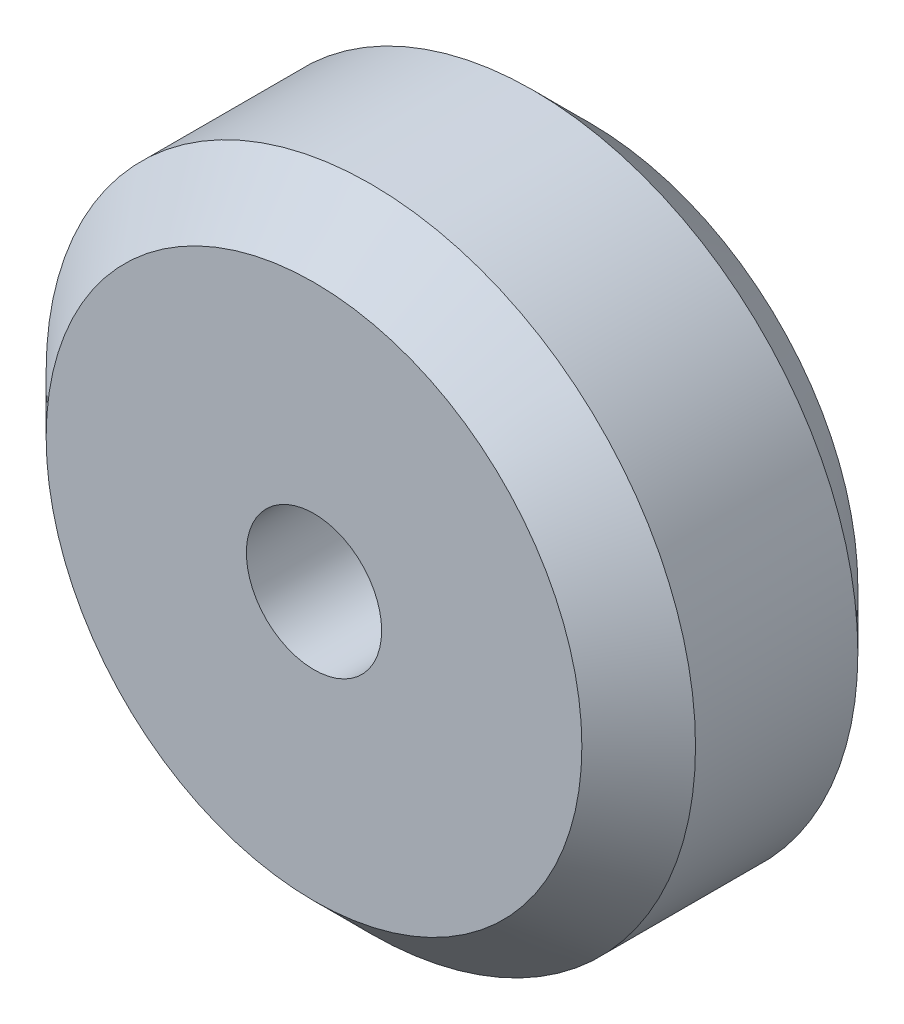
ISO-10303-21;
HEADER;
FILE_DESCRIPTION(('STEP AP214'),'2;1');
FILE_NAME('part.step','',(''),(''),'','','');
FILE_SCHEMA(('AUTOMOTIVE_DESIGN { 1 0 10303 214 1 1 1 1 }'));
ENDSEC;
DATA;
#1=APPLICATION_CONTEXT('core data for automotive mechanical design processes');
#2=APPLICATION_PROTOCOL_DEFINITION('international standard','automotive_design',2000,#1);
#3=PRODUCT_CONTEXT('',#1,'mechanical');
#4=PRODUCT('Part','Part','',(#3));
#5=PRODUCT_RELATED_PRODUCT_CATEGORY('part','',(#4));
#6=PRODUCT_DEFINITION_FORMATION('','',#4);
#7=PRODUCT_DEFINITION_CONTEXT('part definition',#1,'design');
#8=PRODUCT_DEFINITION('design','',#6,#7);
#9=PRODUCT_DEFINITION_SHAPE('','',#8);
#10=(LENGTH_UNIT() NAMED_UNIT(*) SI_UNIT(.MILLI.,.METRE.));
#11=(NAMED_UNIT(*) PLANE_ANGLE_UNIT() SI_UNIT($,.RADIAN.));
#12=(NAMED_UNIT(*) SI_UNIT($,.STERADIAN.) SOLID_ANGLE_UNIT());
#13=UNCERTAINTY_MEASURE_WITH_UNIT(LENGTH_MEASURE(1.E-05),#10,'distance_accuracy_value','');
#14=(GEOMETRIC_REPRESENTATION_CONTEXT(3) GLOBAL_UNCERTAINTY_ASSIGNED_CONTEXT((#13)) GLOBAL_UNIT_ASSIGNED_CONTEXT((#10,
#11,#12)) REPRESENTATION_CONTEXT('',''));
#15=CARTESIAN_POINT('',(0.,0.,0.));
#16=DIRECTION('',(0.,0.,1.));
#17=DIRECTION('',(1.,0.,0.));
#18=AXIS2_PLACEMENT_3D('',#15,#16,#17);
#19=CARTESIAN_POINT('',(0.,0.,10.2));
#20=DIRECTION('',(0.,0.,1.));
#21=DIRECTION('',(1.,0.,0.));
#22=AXIS2_PLACEMENT_3D('',#19,#20,#21);
#23=PLANE('',#22);
#24=CARTESIAN_POINT('',(0.,0.,10.2));
#25=DIRECTION('',(0.,0.,1.));
#26=DIRECTION('',(1.,0.,0.));
#27=AXIS2_PLACEMENT_3D('',#24,#25,#26);
#28=CIRCLE('',#27,9.9);
#29=CARTESIAN_POINT('',(-9.9,0.,10.2));
#30=VERTEX_POINT('',#29);
#31=EDGE_CURVE('E10',#30,#30,#28,.T.);
#32=ORIENTED_EDGE('',*,*,#31,.T.);
#33=EDGE_LOOP('',(#32));
#34=FACE_BOUND('',#33,.T.);
#35=CARTESIAN_POINT('',(0.,0.,10.2));
#36=DIRECTION('',(0.,0.,1.));
#37=DIRECTION('',(1.,0.,0.));
#38=AXIS2_PLACEMENT_3D('',#35,#36,#37);
#39=CIRCLE('',#38,2.5);
#40=CARTESIAN_POINT('',(2.5,0.,10.2));
#41=VERTEX_POINT('',#40);
#42=EDGE_CURVE('E58',#41,#41,#39,.T.);
#43=ORIENTED_EDGE('',*,*,#42,.F.);
#44=EDGE_LOOP('',(#43));
#45=FACE_BOUND('',#44,.T.);
#46=ADVANCED_FACE('F37',(#34,#45),#23,.T.);
#47=CARTESIAN_POINT('',(0.,0.,0.));
#48=DIRECTION('',(0.,0.,1.));
#49=DIRECTION('',(1.,0.,0.));
#50=AXIS2_PLACEMENT_3D('',#47,#48,#49);
#51=PLANE('',#50);
#52=CARTESIAN_POINT('',(0.,0.,0.));
#53=DIRECTION('',(0.,0.,1.));
#54=DIRECTION('',(1.,0.,0.));
#55=AXIS2_PLACEMENT_3D('',#52,#53,#54);
#56=CIRCLE('',#55,9.9);
#57=CARTESIAN_POINT('',(9.9,0.,0.));
#58=VERTEX_POINT('',#57);
#59=EDGE_CURVE('E45',#58,#58,#56,.F.);
#60=ORIENTED_EDGE('',*,*,#59,.T.);
#61=EDGE_LOOP('',(#60));
#62=FACE_BOUND('',#61,.T.);
#63=CARTESIAN_POINT('',(0.,0.,0.));
#64=DIRECTION('',(0.,0.,1.));
#65=DIRECTION('',(1.,0.,0.));
#66=AXIS2_PLACEMENT_3D('',#63,#64,#65);
#67=CIRCLE('',#66,2.5);
#68=CARTESIAN_POINT('',(2.5,0.,0.));
#69=VERTEX_POINT('',#68);
#70=EDGE_CURVE('E59',#69,#69,#67,.T.);
#71=ORIENTED_EDGE('',*,*,#70,.T.);
#72=EDGE_LOOP('',(#71));
#73=FACE_BOUND('',#72,.T.);
#74=ADVANCED_FACE('F69',(#62,#73),#51,.F.);
#75=CARTESIAN_POINT('',(0.,0.,10.2));
#76=DIRECTION('',(0.,0.,-1.));
#77=DIRECTION('',(-1.,0.,0.));
#78=AXIS2_PLACEMENT_3D('',#75,#76,#77);
#79=CYLINDRICAL_SURFACE('',#78,12.);
#80=CARTESIAN_POINT('',(0.,0.,2.09999999999999));
#81=DIRECTION('',(0.,0.,1.));
#82=DIRECTION('',(1.,0.,0.));
#83=AXIS2_PLACEMENT_3D('',#80,#81,#82);
#84=CIRCLE('',#83,12.);
#85=CARTESIAN_POINT('',(12.,0.,2.09999999999999));
#86=VERTEX_POINT('',#85);
#87=EDGE_CURVE('E49',#86,#86,#84,.T.);
#88=ORIENTED_EDGE('',*,*,#87,.T.);
#89=EDGE_LOOP('',(#88));
#90=FACE_BOUND('',#89,.T.);
#91=CARTESIAN_POINT('',(0.,0.,8.09999999999999));
#92=DIRECTION('',(0.,0.,1.));
#93=DIRECTION('',(1.,0.,0.));
#94=AXIS2_PLACEMENT_3D('',#91,#92,#93);
#95=CIRCLE('',#94,12.);
#96=CARTESIAN_POINT('',(-12.,0.,8.09999999999999));
#97=VERTEX_POINT('',#96);
#98=EDGE_CURVE('E53',#97,#97,#95,.F.);
#99=ORIENTED_EDGE('',*,*,#98,.T.);
#100=EDGE_LOOP('',(#99));
#101=FACE_BOUND('',#100,.T.);
#102=ADVANCED_FACE('F74',(#90,#101),#79,.T.);
#103=CARTESIAN_POINT('',(0.,0.,10.2));
#104=DIRECTION('',(0.,0.,-1.));
#105=DIRECTION('',(-1.,0.,0.));
#106=AXIS2_PLACEMENT_3D('',#103,#104,#105);
#107=CYLINDRICAL_SURFACE('',#106,2.5);
#108=ORIENTED_EDGE('',*,*,#42,.T.);
#109=EDGE_LOOP('',(#108));
#110=FACE_BOUND('',#109,.T.);
#111=ORIENTED_EDGE('',*,*,#70,.F.);
#112=EDGE_LOOP('',(#111));
#113=FACE_BOUND('',#112,.T.);
#114=ADVANCED_FACE('F65',(#110,#113),#107,.F.);
#115=CARTESIAN_POINT('',(0.,0.,2.09999999999999));
#116=DIRECTION('',(0.,0.,1.));
#117=DIRECTION('',(1.,0.,0.));
#118=AXIS2_PLACEMENT_3D('',#115,#116,#117);
#119=CONICAL_SURFACE('',#118,12.,0.78539816339745);
#120=ORIENTED_EDGE('',*,*,#59,.F.);
#121=EDGE_LOOP('',(#120));
#122=FACE_BOUND('',#121,.T.);
#123=ORIENTED_EDGE('',*,*,#87,.F.);
#124=EDGE_LOOP('',(#123));
#125=FACE_BOUND('',#124,.T.);
#126=ADVANCED_FACE('F81',(#122,#125),#119,.T.);
#127=CARTESIAN_POINT('',(0.,0.,10.2));
#128=DIRECTION('',(0.,0.,-1.));
#129=DIRECTION('',(-1.,0.,0.));
#130=AXIS2_PLACEMENT_3D('',#127,#128,#129);
#131=CONICAL_SURFACE('',#130,9.9,0.785398163397446);
#132=CARTESIAN_POINT('',(-12.,0.,8.09999999999999));
#133=CARTESIAN_POINT('',(-11.978125,0.,8.12187499999999));
#134=CARTESIAN_POINT('',(-11.95625,0.,8.14374999999999));
#135=CARTESIAN_POINT('',(-11.9125,0.,8.18749999999999));
#136=CARTESIAN_POINT('',(-11.890625,0.,8.20937499999999));
#137=CARTESIAN_POINT('',(-11.846875,0.,8.25312499999999));
#138=CARTESIAN_POINT('',(-11.825,0.,8.27499999999999));
#139=CARTESIAN_POINT('',(-11.78125,0.,8.31874999999999));
#140=CARTESIAN_POINT('',(-11.759375,0.,8.34062499999999));
#141=CARTESIAN_POINT('',(-11.715625,0.,8.38437499999999));
#142=CARTESIAN_POINT('',(-11.69375,0.,8.40624999999999));
#143=CARTESIAN_POINT('',(-11.65,0.,8.44999999999999));
#144=CARTESIAN_POINT('',(-11.628125,0.,8.47187499999999));
#145=CARTESIAN_POINT('',(-11.584375,0.,8.51562499999999));
#146=CARTESIAN_POINT('',(-11.5625,0.,8.53749999999999));
#147=CARTESIAN_POINT('',(-11.51875,0.,8.58124999999999));
#148=CARTESIAN_POINT('',(-11.496875,0.,8.60312499999999));
#149=CARTESIAN_POINT('',(-11.453125,0.,8.64687499999999));
#150=CARTESIAN_POINT('',(-11.43125,0.,8.66874999999999));
#151=CARTESIAN_POINT('',(-11.3875,0.,8.71249999999999));
#152=CARTESIAN_POINT('',(-11.365625,0.,8.73437499999999));
#153=CARTESIAN_POINT('',(-11.321875,0.,8.77812499999999));
#154=CARTESIAN_POINT('',(-11.3,0.,8.79999999999999));
#155=CARTESIAN_POINT('',(-11.25625,0.,8.84374999999999));
#156=CARTESIAN_POINT('',(-11.234375,0.,8.86562499999999));
#157=CARTESIAN_POINT('',(-11.190625,0.,8.90937499999999));
#158=CARTESIAN_POINT('',(-11.16875,0.,8.93124999999999));
#159=CARTESIAN_POINT('',(-11.125,0.,8.97499999999999));
#160=CARTESIAN_POINT('',(-11.103125,0.,8.99687499999999));
#161=CARTESIAN_POINT('',(-11.059375,0.,9.04062499999999));
#162=CARTESIAN_POINT('',(-11.0375,0.,9.06249999999999));
#163=CARTESIAN_POINT('',(-10.99375,0.,9.10624999999999));
#164=CARTESIAN_POINT('',(-10.971875,0.,9.12812499999999));
#165=CARTESIAN_POINT('',(-10.928125,0.,9.17187499999999));
#166=CARTESIAN_POINT('',(-10.90625,0.,9.19374999999999));
#167=CARTESIAN_POINT('',(-10.8625,0.,9.23749999999999));
#168=CARTESIAN_POINT('',(-10.840625,0.,9.25937499999999));
#169=CARTESIAN_POINT('',(-10.796875,0.,9.30312499999999));
#170=CARTESIAN_POINT('',(-10.775,0.,9.32499999999999));
#171=CARTESIAN_POINT('',(-10.73125,0.,9.36874999999999));
#172=CARTESIAN_POINT('',(-10.709375,0.,9.39062499999999));
#173=CARTESIAN_POINT('',(-10.665625,0.,9.434375));
#174=CARTESIAN_POINT('',(-10.64375,0.,9.45624999999999));
#175=CARTESIAN_POINT('',(-10.6,0.,9.49999999999999));
#176=CARTESIAN_POINT('',(-10.578125,0.,9.521875));
#177=CARTESIAN_POINT('',(-10.534375,0.,9.56562499999999));
#178=CARTESIAN_POINT('',(-10.5125,0.,9.5875));
#179=CARTESIAN_POINT('',(-10.46875,0.,9.63125));
#180=CARTESIAN_POINT('',(-10.446875,0.,9.653125));
#181=CARTESIAN_POINT('',(-10.403125,0.,9.696875));
#182=CARTESIAN_POINT('',(-10.38125,0.,9.71875));
#183=CARTESIAN_POINT('',(-10.3375,0.,9.7625));
#184=CARTESIAN_POINT('',(-10.315625,0.,9.784375));
#185=CARTESIAN_POINT('',(-10.271875,0.,9.828125));
#186=CARTESIAN_POINT('',(-10.25,0.,9.85));
#187=CARTESIAN_POINT('',(-10.20625,0.,9.89375));
#188=CARTESIAN_POINT('',(-10.184375,0.,9.915625));
#189=CARTESIAN_POINT('',(-10.140625,0.,9.959375));
#190=CARTESIAN_POINT('',(-10.11875,0.,9.98125));
#191=CARTESIAN_POINT('',(-10.075,0.,10.025));
#192=CARTESIAN_POINT('',(-10.053125,0.,10.046875));
#193=CARTESIAN_POINT('',(-10.009375,0.,10.090625));
#194=CARTESIAN_POINT('',(-9.9875,0.,10.1125));
#195=CARTESIAN_POINT('',(-9.94375,0.,10.15625));
#196=CARTESIAN_POINT('',(-9.921875,0.,10.178125));
#197=CARTESIAN_POINT('',(-9.9,0.,10.2));
#198=B_SPLINE_CURVE_WITH_KNOTS('',3,(#132,#133,#134,#135,#136,#137,#138,#139,#140,#141,#142,
#143,#144,#145,#146,#147,#148,#149,#150,#151,#152,#153,#154,#155,#156,#157,#158,#159,#160,#161,
#162,#163,#164,#165,#166,#167,#168,#169,#170,#171,#172,#173,#174,#175,#176,#177,#178,#179,#180,
#181,#182,#183,#184,#185,#186,#187,#188,#189,#190,#191,#192,#193,#194,#195,#196,#197),
.UNSPECIFIED.,.F.,.F.,(4,2,2,2,2,2,2,2,2,2,2,2,2,2,2,2,2,2,2,2,2,2,2,2,2,2,2,2,2,2,2,2,4),(0.,
0.0928077650307352,0.185615530061469,0.278423295092203,0.371231060122939,0.464038825153673,
0.556846590184407,0.649654355215142,0.742462120245876,0.835269885276612,0.928077650307347,
1.02088541533808,1.11369318036881,1.20650094539955,1.29930871043028,1.39211647546102,
1.48492424049175,1.57773200552249,1.67053977055322,1.76334753558396,1.85615530061469,
1.94896306564543,2.04177083067616,2.1345785957069,2.22738636073763,2.32019412576836,
2.4130018907991,2.50580965582984,2.59861742086057,2.6914251858913,2.78423295092204,
2.87704071595277,2.96984848098351),.UNSPECIFIED.);
#199=EDGE_CURVE('BSEAM40',#97,#30,#198,.T.);
#200=ORIENTED_EDGE('',*,*,#98,.F.);
#201=ORIENTED_EDGE('',*,*,#31,.F.);
#202=ORIENTED_EDGE('',*,*,#199,.T.);
#203=ORIENTED_EDGE('',*,*,#199,.F.);
#204=EDGE_LOOP('',(#200,#202,#201,#203));
#205=FACE_BOUND('',#204,.T.);
#206=ADVANCED_FACE('F40',(#205),#131,.T.);
#207=CLOSED_SHELL('',(#46,#74,#102,#114,#126,#206));
#208=MANIFOLD_SOLID_BREP('B2',#207);
#209=ADVANCED_BREP_SHAPE_REPRESENTATION('',(#18,#208),#14);
#210=SHAPE_DEFINITION_REPRESENTATION(#9,#209);
ENDSEC;
END-ISO-10303-21;
